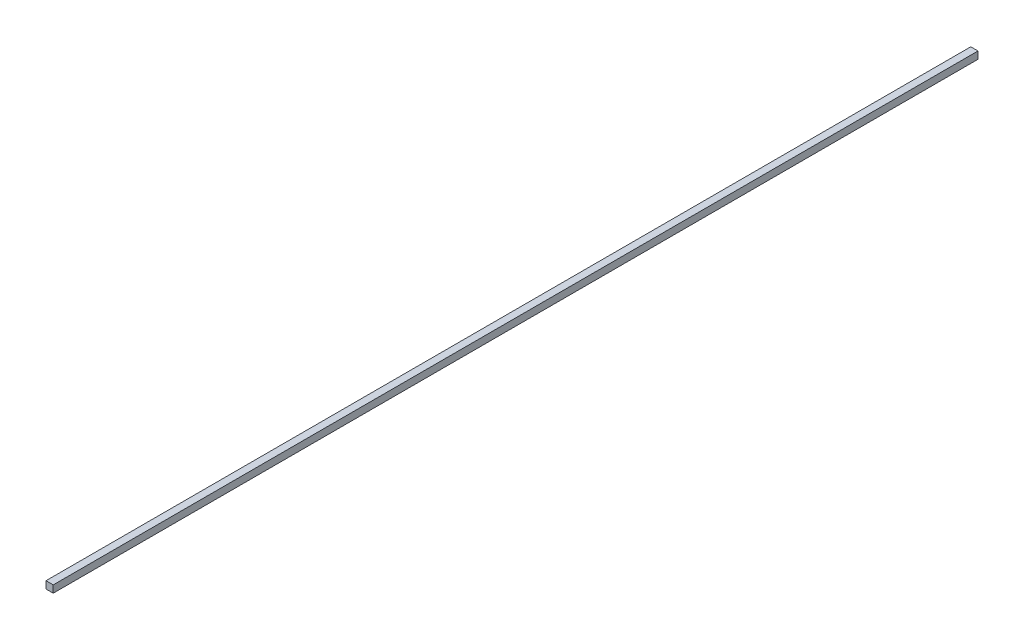
ISO-10303-21;
HEADER;
FILE_DESCRIPTION(('STEP AP214'),'2;1');
FILE_NAME('part.step','',(''),(''),'','','');
FILE_SCHEMA(('AUTOMOTIVE_DESIGN { 1 0 10303 214 1 1 1 1 }'));
ENDSEC;
DATA;
#1=APPLICATION_CONTEXT('core data for automotive mechanical design processes');
#2=APPLICATION_PROTOCOL_DEFINITION('international standard','automotive_design',2000,#1);
#3=PRODUCT_CONTEXT('',#1,'mechanical');
#4=PRODUCT('Part','Part','',(#3));
#5=PRODUCT_RELATED_PRODUCT_CATEGORY('part','',(#4));
#6=PRODUCT_DEFINITION_FORMATION('','',#4);
#7=PRODUCT_DEFINITION_CONTEXT('part definition',#1,'design');
#8=PRODUCT_DEFINITION('design','',#6,#7);
#9=PRODUCT_DEFINITION_SHAPE('','',#8);
#10=(LENGTH_UNIT() NAMED_UNIT(*) SI_UNIT(.MILLI.,.METRE.));
#11=(NAMED_UNIT(*) PLANE_ANGLE_UNIT() SI_UNIT($,.RADIAN.));
#12=(NAMED_UNIT(*) SI_UNIT($,.STERADIAN.) SOLID_ANGLE_UNIT());
#13=UNCERTAINTY_MEASURE_WITH_UNIT(LENGTH_MEASURE(1.E-05),#10,'distance_accuracy_value','');
#14=(GEOMETRIC_REPRESENTATION_CONTEXT(3) GLOBAL_UNCERTAINTY_ASSIGNED_CONTEXT((#13)) GLOBAL_UNIT_ASSIGNED_CONTEXT((#10,
#11,#12)) REPRESENTATION_CONTEXT('',''));
#15=CARTESIAN_POINT('',(0.,0.,0.));
#16=DIRECTION('',(0.,0.,1.));
#17=DIRECTION('',(1.,0.,0.));
#18=AXIS2_PLACEMENT_3D('',#15,#16,#17);
#19=CARTESIAN_POINT('',(-1.190625,1.190625,-304.8));
#20=DIRECTION('',(-1.,0.,0.));
#21=DIRECTION('',(0.,0.,1.));
#22=AXIS2_PLACEMENT_3D('',#19,#20,#21);
#23=PLANE('',#22);
#24=DIRECTION('',(0.,-1.,0.));
#25=VECTOR('',#24,1.);
#26=CARTESIAN_POINT('',(-1.190625,1.190625,0.));
#27=LINE('',#26,#25);
#28=CARTESIAN_POINT('',(-1.190625,1.190625,0.));
#29=VERTEX_POINT('',#28);
#30=CARTESIAN_POINT('',(-1.190625,-1.190625,0.));
#31=VERTEX_POINT('',#30);
#32=EDGE_CURVE('E95',#29,#31,#27,.T.);
#33=ORIENTED_EDGE('',*,*,#32,.F.);
#34=DIRECTION('',(0.,0.,1.));
#35=VECTOR('',#34,1.);
#36=CARTESIAN_POINT('',(-1.190625,1.190625,-304.8));
#37=LINE('',#36,#35);
#38=CARTESIAN_POINT('',(-1.190625,1.190625,-304.8));
#39=VERTEX_POINT('',#38);
#40=EDGE_CURVE('E11',#39,#29,#37,.T.);
#41=ORIENTED_EDGE('',*,*,#40,.F.);
#42=DIRECTION('',(0.,-1.,0.));
#43=VECTOR('',#42,1.);
#44=CARTESIAN_POINT('',(-1.190625,1.190625,-304.8));
#45=LINE('',#44,#43);
#46=CARTESIAN_POINT('',(-1.190625,-1.190625,-304.8));
#47=VERTEX_POINT('',#46);
#48=EDGE_CURVE('E89',#39,#47,#45,.T.);
#49=ORIENTED_EDGE('',*,*,#48,.T.);
#50=DIRECTION('',(0.,0.,1.));
#51=VECTOR('',#50,1.);
#52=CARTESIAN_POINT('',(-1.190625,-1.190625,-304.8));
#53=LINE('',#52,#51);
#54=EDGE_CURVE('E34',#47,#31,#53,.T.);
#55=ORIENTED_EDGE('',*,*,#54,.T.);
#56=EDGE_LOOP('',(#33,#41,#49,#55));
#57=FACE_BOUND('',#56,.T.);
#58=ADVANCED_FACE('F31',(#57),#23,.T.);
#59=CARTESIAN_POINT('',(-1.190625,1.190625,-304.8));
#60=DIRECTION('',(0.,1.,0.));
#61=DIRECTION('',(0.,0.,1.));
#62=AXIS2_PLACEMENT_3D('',#59,#60,#61);
#63=PLANE('',#62);
#64=DIRECTION('',(-1.,0.,0.));
#65=VECTOR('',#64,1.);
#66=CARTESIAN_POINT('',(-1.190625,1.190625,0.));
#67=LINE('',#66,#65);
#68=CARTESIAN_POINT('',(1.190625,1.190625,0.));
#69=VERTEX_POINT('',#68);
#70=EDGE_CURVE('E91',#69,#29,#67,.T.);
#71=ORIENTED_EDGE('',*,*,#70,.F.);
#72=DIRECTION('',(0.,0.,1.));
#73=VECTOR('',#72,1.);
#74=CARTESIAN_POINT('',(1.190625,1.190625,-304.8));
#75=LINE('',#74,#73);
#76=CARTESIAN_POINT('',(1.190625,1.190625,-304.8));
#77=VERTEX_POINT('',#76);
#78=EDGE_CURVE('E40',#77,#69,#75,.T.);
#79=ORIENTED_EDGE('',*,*,#78,.F.);
#80=DIRECTION('',(-1.,0.,0.));
#81=VECTOR('',#80,1.);
#82=CARTESIAN_POINT('',(-1.190625,1.190625,-304.8));
#83=LINE('',#82,#81);
#84=EDGE_CURVE('E86',#77,#39,#83,.T.);
#85=ORIENTED_EDGE('',*,*,#84,.T.);
#86=ORIENTED_EDGE('',*,*,#40,.T.);
#87=EDGE_LOOP('',(#71,#79,#85,#86));
#88=FACE_BOUND('',#87,.T.);
#89=ADVANCED_FACE('F105',(#88),#63,.T.);
#90=CARTESIAN_POINT('',(1.190625,1.190625,-304.8));
#91=DIRECTION('',(1.,0.,0.));
#92=DIRECTION('',(0.,1.,0.));
#93=AXIS2_PLACEMENT_3D('',#90,#91,#92);
#94=PLANE('',#93);
#95=DIRECTION('',(0.,1.,0.));
#96=VECTOR('',#95,1.);
#97=CARTESIAN_POINT('',(1.190625,1.190625,0.));
#98=LINE('',#97,#96);
#99=CARTESIAN_POINT('',(1.190625,-1.190625,0.));
#100=VERTEX_POINT('',#99);
#101=EDGE_CURVE('E81',#100,#69,#98,.T.);
#102=ORIENTED_EDGE('',*,*,#101,.F.);
#103=DIRECTION('',(0.,0.,1.));
#104=VECTOR('',#103,1.);
#105=CARTESIAN_POINT('',(1.190625,-1.190625,-304.8));
#106=LINE('',#105,#104);
#107=CARTESIAN_POINT('',(1.190625,-1.190625,-304.8));
#108=VERTEX_POINT('',#107);
#109=EDGE_CURVE('E76',#108,#100,#106,.T.);
#110=ORIENTED_EDGE('',*,*,#109,.F.);
#111=DIRECTION('',(0.,1.,0.));
#112=VECTOR('',#111,1.);
#113=CARTESIAN_POINT('',(1.190625,1.190625,-304.8));
#114=LINE('',#113,#112);
#115=EDGE_CURVE('E79',#108,#77,#114,.T.);
#116=ORIENTED_EDGE('',*,*,#115,.T.);
#117=ORIENTED_EDGE('',*,*,#78,.T.);
#118=EDGE_LOOP('',(#102,#110,#116,#117));
#119=FACE_BOUND('',#118,.T.);
#120=ADVANCED_FACE('F78',(#119),#94,.T.);
#121=CARTESIAN_POINT('',(-1.190625,-1.190625,-304.8));
#122=DIRECTION('',(0.,-1.,0.));
#123=DIRECTION('',(0.,0.,-1.));
#124=AXIS2_PLACEMENT_3D('',#121,#122,#123);
#125=PLANE('',#124);
#126=DIRECTION('',(1.,0.,0.));
#127=VECTOR('',#126,1.);
#128=CARTESIAN_POINT('',(-1.190625,-1.190625,0.));
#129=LINE('',#128,#127);
#130=EDGE_CURVE('E98',#31,#100,#129,.T.);
#131=ORIENTED_EDGE('',*,*,#130,.F.);
#132=ORIENTED_EDGE('',*,*,#54,.F.);
#133=DIRECTION('',(1.,0.,0.));
#134=VECTOR('',#133,1.);
#135=CARTESIAN_POINT('',(-1.190625,-1.190625,-304.8));
#136=LINE('',#135,#134);
#137=EDGE_CURVE('E85',#47,#108,#136,.T.);
#138=ORIENTED_EDGE('',*,*,#137,.T.);
#139=ORIENTED_EDGE('',*,*,#109,.T.);
#140=EDGE_LOOP('',(#131,#132,#138,#139));
#141=FACE_BOUND('',#140,.T.);
#142=ADVANCED_FACE('F88',(#141),#125,.T.);
#143=CARTESIAN_POINT('',(-1.190625,-1.190625,-304.8));
#144=DIRECTION('',(0.,0.,1.));
#145=DIRECTION('',(1.,0.,0.));
#146=AXIS2_PLACEMENT_3D('',#143,#144,#145);
#147=PLANE('',#146);
#148=ORIENTED_EDGE('',*,*,#48,.F.);
#149=ORIENTED_EDGE('',*,*,#84,.F.);
#150=ORIENTED_EDGE('',*,*,#115,.F.);
#151=ORIENTED_EDGE('',*,*,#137,.F.);
#152=EDGE_LOOP('',(#148,#149,#150,#151));
#153=FACE_BOUND('',#152,.T.);
#154=ADVANCED_FACE('F84',(#153),#147,.F.);
#155=CARTESIAN_POINT('',(-1.190625,-1.190625,0.));
#156=DIRECTION('',(0.,0.,1.));
#157=DIRECTION('',(1.,0.,0.));
#158=AXIS2_PLACEMENT_3D('',#155,#156,#157);
#159=PLANE('',#158);
#160=ORIENTED_EDGE('',*,*,#32,.T.);
#161=ORIENTED_EDGE('',*,*,#130,.T.);
#162=ORIENTED_EDGE('',*,*,#101,.T.);
#163=ORIENTED_EDGE('',*,*,#70,.T.);
#164=EDGE_LOOP('',(#160,#161,#162,#163));
#165=FACE_BOUND('',#164,.T.);
#166=ADVANCED_FACE('F104',(#165),#159,.T.);
#167=CLOSED_SHELL('',(#58,#89,#120,#142,#154,#166));
#168=MANIFOLD_SOLID_BREP('B2',#167);
#169=ADVANCED_BREP_SHAPE_REPRESENTATION('',(#18,#168),#14);
#170=SHAPE_DEFINITION_REPRESENTATION(#9,#169);
ENDSEC;
END-ISO-10303-21;
